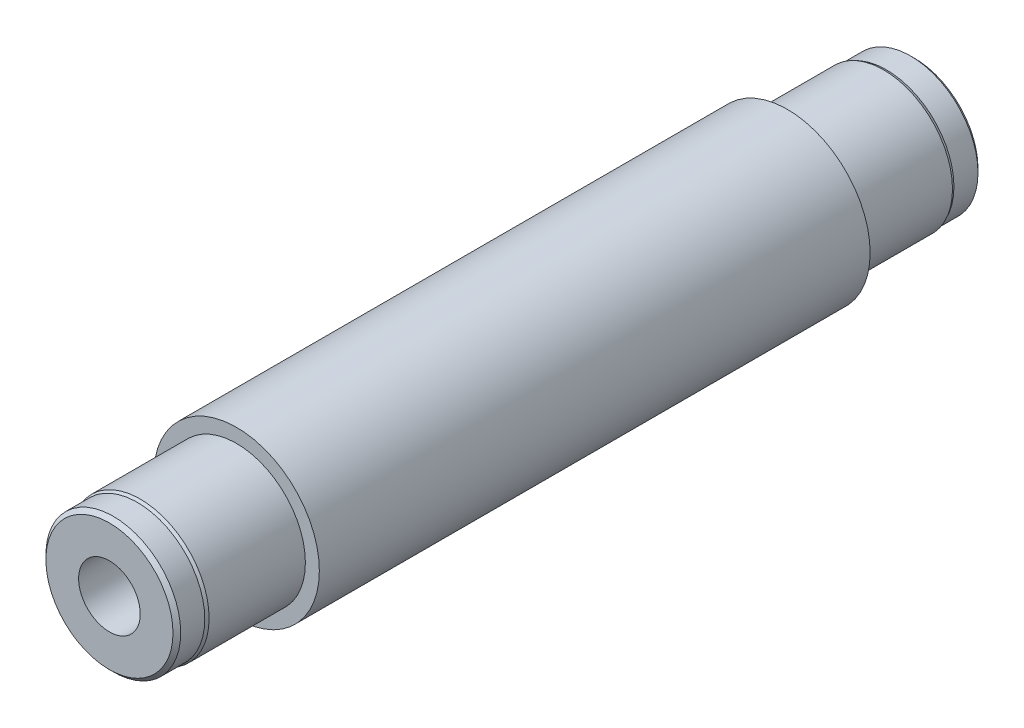
ISO-10303-21;
HEADER;
FILE_DESCRIPTION(('STEP AP214'),'2;1');
FILE_NAME('part.step','',(''),(''),'','','');
FILE_SCHEMA(('AUTOMOTIVE_DESIGN { 1 0 10303 214 1 1 1 1 }'));
ENDSEC;
DATA;
#1=APPLICATION_CONTEXT('core data for automotive mechanical design processes');
#2=APPLICATION_PROTOCOL_DEFINITION('international standard','automotive_design',2000,#1);
#3=PRODUCT_CONTEXT('',#1,'mechanical');
#4=PRODUCT('Part','Part','',(#3));
#5=PRODUCT_RELATED_PRODUCT_CATEGORY('part','',(#4));
#6=PRODUCT_DEFINITION_FORMATION('','',#4);
#7=PRODUCT_DEFINITION_CONTEXT('part definition',#1,'design');
#8=PRODUCT_DEFINITION('design','',#6,#7);
#9=PRODUCT_DEFINITION_SHAPE('','',#8);
#10=(LENGTH_UNIT() NAMED_UNIT(*) SI_UNIT(.MILLI.,.METRE.));
#11=(NAMED_UNIT(*) PLANE_ANGLE_UNIT() SI_UNIT($,.RADIAN.));
#12=(NAMED_UNIT(*) SI_UNIT($,.STERADIAN.) SOLID_ANGLE_UNIT());
#13=UNCERTAINTY_MEASURE_WITH_UNIT(LENGTH_MEASURE(1.E-05),#10,'distance_accuracy_value','');
#14=(GEOMETRIC_REPRESENTATION_CONTEXT(3) GLOBAL_UNCERTAINTY_ASSIGNED_CONTEXT((#13)) GLOBAL_UNIT_ASSIGNED_CONTEXT((#10,
#11,#12)) REPRESENTATION_CONTEXT('',''));
#15=CARTESIAN_POINT('',(0.,0.,0.));
#16=DIRECTION('',(0.,0.,1.));
#17=DIRECTION('',(1.,0.,0.));
#18=AXIS2_PLACEMENT_3D('',#15,#16,#17);
#19=CARTESIAN_POINT('',(0.,0.,19.3));
#20=DIRECTION('',(0.,0.,-1.));
#21=DIRECTION('',(1.,0.,0.));
#22=AXIS2_PLACEMENT_3D('',#19,#20,#21);
#23=CONICAL_SURFACE('',#22,3.575,0.463647609001);
#24=CARTESIAN_POINT('',(0.,0.,19.45));
#25=DIRECTION('',(0.,0.,1.));
#26=DIRECTION('',(1.,0.,0.));
#27=AXIS2_PLACEMENT_3D('',#24,#25,#26);
#28=CIRCLE('',#27,3.5);
#29=CARTESIAN_POINT('',(3.5,0.,19.45));
#30=VERTEX_POINT('',#29);
#31=EDGE_CURVE('E106',#30,#30,#28,.T.);
#32=ORIENTED_EDGE('',*,*,#31,.F.);
#33=DIRECTION('',(-0.447213595499958,0.,0.894427190999916));
#34=VECTOR('',#33,1.);
#35=CARTESIAN_POINT('',(3.575,0.,19.3));
#36=LINE('',#35,#34);
#37=CARTESIAN_POINT('',(3.575,0.,19.3));
#38=VERTEX_POINT('',#37);
#39=EDGE_CURVE('E9',#38,#30,#36,.T.);
#40=ORIENTED_EDGE('',*,*,#39,.F.);
#41=CARTESIAN_POINT('',(0.,0.,19.3));
#42=DIRECTION('',(0.,0.,1.));
#43=DIRECTION('',(1.,0.,0.));
#44=AXIS2_PLACEMENT_3D('',#41,#42,#43);
#45=CIRCLE('',#44,3.575);
#46=EDGE_CURVE('E110',#38,#38,#45,.T.);
#47=ORIENTED_EDGE('',*,*,#46,.T.);
#48=ORIENTED_EDGE('',*,*,#39,.T.);
#49=EDGE_LOOP('',(#32,#40,#47,#48));
#50=FACE_BOUND('',#49,.T.);
#51=ADVANCED_FACE('F14',(#50),#23,.T.);
#52=CARTESIAN_POINT('',(0.,0.,-20.9));
#53=DIRECTION('',(0.,0.,1.));
#54=DIRECTION('',(1.,0.,0.));
#55=AXIS2_PLACEMENT_3D('',#52,#53,#54);
#56=CYLINDRICAL_SURFACE('',#55,3.5);
#57=ORIENTED_EDGE('',*,*,#31,.T.);
#58=DIRECTION('',(0.,0.,1.));
#59=VECTOR('',#58,1.);
#60=CARTESIAN_POINT('',(3.5,0.,-20.9));
#61=LINE('',#60,#59);
#62=CARTESIAN_POINT('',(3.5,0.,20.7));
#63=VERTEX_POINT('',#62);
#64=EDGE_CURVE('E18',#30,#63,#61,.T.);
#65=ORIENTED_EDGE('',*,*,#64,.T.);
#66=CARTESIAN_POINT('',(0.,0.,20.7));
#67=DIRECTION('',(0.,0.,1.));
#68=DIRECTION('',(1.,0.,0.));
#69=AXIS2_PLACEMENT_3D('',#66,#67,#68);
#70=CIRCLE('',#69,3.5);
#71=EDGE_CURVE('E115',#63,#63,#70,.T.);
#72=ORIENTED_EDGE('',*,*,#71,.F.);
#73=ORIENTED_EDGE('',*,*,#64,.F.);
#74=EDGE_LOOP('',(#57,#65,#72,#73));
#75=FACE_BOUND('',#74,.T.);
#76=ADVANCED_FACE('F211',(#75),#56,.T.);
#77=CARTESIAN_POINT('',(0.,0.,-19.3));
#78=DIRECTION('',(0.,0.,1.));
#79=DIRECTION('',(1.,0.,0.));
#80=AXIS2_PLACEMENT_3D('',#77,#78,#79);
#81=CYLINDRICAL_SURFACE('',#80,3.575);
#82=DIRECTION('',(0.,0.,1.));
#83=VECTOR('',#82,1.);
#84=CARTESIAN_POINT('',(3.575,0.,-19.3));
#85=LINE('',#84,#83);
#86=CARTESIAN_POINT('',(3.575,0.,14.3));
#87=VERTEX_POINT('',#86);
#88=EDGE_CURVE('E111',#87,#38,#85,.T.);
#89=ORIENTED_EDGE('',*,*,#88,.T.);
#90=ORIENTED_EDGE('',*,*,#46,.F.);
#91=ORIENTED_EDGE('',*,*,#88,.F.);
#92=CARTESIAN_POINT('',(0.,0.,14.3));
#93=DIRECTION('',(0.,0.,1.));
#94=DIRECTION('',(1.,0.,0.));
#95=AXIS2_PLACEMENT_3D('',#92,#93,#94);
#96=CIRCLE('',#95,3.575);
#97=EDGE_CURVE('E105',#87,#87,#96,.T.);
#98=ORIENTED_EDGE('',*,*,#97,.T.);
#99=EDGE_LOOP('',(#89,#90,#91,#98));
#100=FACE_BOUND('',#99,.T.);
#101=ADVANCED_FACE('F216',(#100),#81,.T.);
#102=CARTESIAN_POINT('',(0.,0.,20.7));
#103=DIRECTION('',(0.,0.,-1.));
#104=DIRECTION('',(1.,0.,0.));
#105=AXIS2_PLACEMENT_3D('',#102,#103,#104);
#106=CONICAL_SURFACE('',#105,3.5,0.785398163397);
#107=DIRECTION('',(-0.707106781186548,0.,0.707106781186548));
#108=VECTOR('',#107,1.);
#109=CARTESIAN_POINT('',(3.5,0.,20.7));
#110=LINE('',#109,#108);
#111=CARTESIAN_POINT('',(3.3,0.,20.9));
#112=VERTEX_POINT('',#111);
#113=EDGE_CURVE('E127',#63,#112,#110,.T.);
#114=ORIENTED_EDGE('',*,*,#113,.F.);
#115=ORIENTED_EDGE('',*,*,#71,.T.);
#116=ORIENTED_EDGE('',*,*,#113,.T.);
#117=CARTESIAN_POINT('',(0.,0.,20.9));
#118=DIRECTION('',(0.,0.,1.));
#119=DIRECTION('',(1.,0.,0.));
#120=AXIS2_PLACEMENT_3D('',#117,#118,#119);
#121=CIRCLE('',#120,3.3);
#122=EDGE_CURVE('E90',#112,#112,#121,.T.);
#123=ORIENTED_EDGE('',*,*,#122,.F.);
#124=EDGE_LOOP('',(#114,#115,#116,#123));
#125=FACE_BOUND('',#124,.T.);
#126=ADVANCED_FACE('F16',(#125),#106,.T.);
#127=CARTESIAN_POINT('',(0.,0.,14.3));
#128=DIRECTION('',(0.,0.,1.));
#129=DIRECTION('',(1.,0.,0.));
#130=AXIS2_PLACEMENT_3D('',#127,#128,#129);
#131=PLANE('',#130);
#132=ORIENTED_EDGE('',*,*,#97,.F.);
#133=EDGE_LOOP('',(#132));
#134=FACE_BOUND('',#133,.T.);
#135=CARTESIAN_POINT('',(0.,0.,14.3));
#136=DIRECTION('',(0.,0.,1.));
#137=DIRECTION('',(1.,0.,0.));
#138=AXIS2_PLACEMENT_3D('',#135,#136,#137);
#139=CIRCLE('',#138,4.3);
#140=CARTESIAN_POINT('',(4.3,0.,14.3));
#141=VERTEX_POINT('',#140);
#142=EDGE_CURVE('E86',#141,#141,#139,.T.);
#143=ORIENTED_EDGE('',*,*,#142,.T.);
#144=EDGE_LOOP('',(#143));
#145=FACE_BOUND('',#144,.T.);
#146=ADVANCED_FACE('F93',(#134,#145),#131,.T.);
#147=CARTESIAN_POINT('',(0.,0.,20.9));
#148=DIRECTION('',(0.,0.,1.));
#149=DIRECTION('',(1.,0.,0.));
#150=AXIS2_PLACEMENT_3D('',#147,#148,#149);
#151=PLANE('',#150);
#152=CARTESIAN_POINT('',(0.,0.,20.9));
#153=DIRECTION('',(0.,0.,1.));
#154=DIRECTION('',(1.,0.,0.));
#155=AXIS2_PLACEMENT_3D('',#152,#153,#154);
#156=CIRCLE('',#155,1.6);
#157=CARTESIAN_POINT('',(1.6,0.,20.9));
#158=VERTEX_POINT('',#157);
#159=EDGE_CURVE('E95',#158,#158,#156,.T.);
#160=ORIENTED_EDGE('',*,*,#159,.F.);
#161=EDGE_LOOP('',(#160));
#162=FACE_BOUND('',#161,.T.);
#163=ORIENTED_EDGE('',*,*,#122,.T.);
#164=EDGE_LOOP('',(#163));
#165=FACE_BOUND('',#164,.T.);
#166=ADVANCED_FACE('F276',(#162,#165),#151,.T.);
#167=CARTESIAN_POINT('',(0.,0.,-14.3));
#168=DIRECTION('',(0.,0.,1.));
#169=DIRECTION('',(1.,0.,0.));
#170=AXIS2_PLACEMENT_3D('',#167,#168,#169);
#171=CYLINDRICAL_SURFACE('',#170,4.3);
#172=ORIENTED_EDGE('',*,*,#142,.F.);
#173=DIRECTION('',(0.,0.,1.));
#174=VECTOR('',#173,1.);
#175=CARTESIAN_POINT('',(4.3,0.,-14.3));
#176=LINE('',#175,#174);
#177=CARTESIAN_POINT('',(4.3,0.,-14.3));
#178=VERTEX_POINT('',#177);
#179=EDGE_CURVE('E83',#178,#141,#176,.T.);
#180=ORIENTED_EDGE('',*,*,#179,.F.);
#181=CARTESIAN_POINT('',(0.,0.,-14.3));
#182=DIRECTION('',(0.,0.,1.));
#183=DIRECTION('',(1.,0.,0.));
#184=AXIS2_PLACEMENT_3D('',#181,#182,#183);
#185=CIRCLE('',#184,4.3);
#186=EDGE_CURVE('E88',#178,#178,#185,.T.);
#187=ORIENTED_EDGE('',*,*,#186,.T.);
#188=ORIENTED_EDGE('',*,*,#179,.T.);
#189=EDGE_LOOP('',(#172,#180,#187,#188));
#190=FACE_BOUND('',#189,.T.);
#191=ADVANCED_FACE('F85',(#190),#171,.T.);
#192=CARTESIAN_POINT('',(0.,0.,-21.9));
#193=DIRECTION('',(0.,0.,1.));
#194=DIRECTION('',(1.,0.,0.));
#195=AXIS2_PLACEMENT_3D('',#192,#193,#194);
#196=CYLINDRICAL_SURFACE('',#195,1.6);
#197=DIRECTION('',(0.,0.,1.));
#198=VECTOR('',#197,1.);
#199=CARTESIAN_POINT('',(1.6,0.,-21.9));
#200=LINE('',#199,#198);
#201=CARTESIAN_POINT('',(1.6,0.,-20.9));
#202=VERTEX_POINT('',#201);
#203=EDGE_CURVE('E100',#202,#158,#200,.T.);
#204=ORIENTED_EDGE('',*,*,#203,.F.);
#205=CARTESIAN_POINT('',(0.,0.,-20.9));
#206=DIRECTION('',(0.,0.,1.));
#207=DIRECTION('',(1.,0.,0.));
#208=AXIS2_PLACEMENT_3D('',#205,#206,#207);
#209=CIRCLE('',#208,1.6);
#210=EDGE_CURVE('E122',#202,#202,#209,.T.);
#211=ORIENTED_EDGE('',*,*,#210,.F.);
#212=ORIENTED_EDGE('',*,*,#203,.T.);
#213=ORIENTED_EDGE('',*,*,#159,.T.);
#214=EDGE_LOOP('',(#204,#211,#212,#213));
#215=FACE_BOUND('',#214,.T.);
#216=ADVANCED_FACE('F172',(#215),#196,.F.);
#217=CARTESIAN_POINT('',(0.,0.,-14.3));
#218=DIRECTION('',(0.,0.,1.));
#219=DIRECTION('',(1.,0.,0.));
#220=AXIS2_PLACEMENT_3D('',#217,#218,#219);
#221=PLANE('',#220);
#222=CARTESIAN_POINT('',(0.,0.,-14.3));
#223=DIRECTION('',(0.,0.,1.));
#224=DIRECTION('',(1.,0.,0.));
#225=AXIS2_PLACEMENT_3D('',#222,#223,#224);
#226=CIRCLE('',#225,3.575);
#227=CARTESIAN_POINT('',(3.575,0.,-14.3));
#228=VERTEX_POINT('',#227);
#229=EDGE_CURVE('E139',#228,#228,#226,.T.);
#230=ORIENTED_EDGE('',*,*,#229,.T.);
#231=EDGE_LOOP('',(#230));
#232=FACE_BOUND('',#231,.T.);
#233=ORIENTED_EDGE('',*,*,#186,.F.);
#234=EDGE_LOOP('',(#233));
#235=FACE_BOUND('',#234,.T.);
#236=ADVANCED_FACE('F179',(#232,#235),#221,.F.);
#237=CARTESIAN_POINT('',(0.,0.,-20.9));
#238=DIRECTION('',(0.,0.,1.));
#239=DIRECTION('',(1.,0.,0.));
#240=AXIS2_PLACEMENT_3D('',#237,#238,#239);
#241=PLANE('',#240);
#242=ORIENTED_EDGE('',*,*,#210,.T.);
#243=EDGE_LOOP('',(#242));
#244=FACE_BOUND('',#243,.T.);
#245=CARTESIAN_POINT('',(0.,0.,-20.9));
#246=DIRECTION('',(0.,0.,1.));
#247=DIRECTION('',(1.,0.,0.));
#248=AXIS2_PLACEMENT_3D('',#245,#246,#247);
#249=CIRCLE('',#248,3.3);
#250=CARTESIAN_POINT('',(3.3,0.,-20.9));
#251=VERTEX_POINT('',#250);
#252=EDGE_CURVE('E116',#251,#251,#249,.T.);
#253=ORIENTED_EDGE('',*,*,#252,.F.);
#254=EDGE_LOOP('',(#253));
#255=FACE_BOUND('',#254,.T.);
#256=ADVANCED_FACE('F175',(#244,#255),#241,.F.);
#257=CARTESIAN_POINT('',(0.,0.,-19.3));
#258=DIRECTION('',(0.,0.,1.));
#259=DIRECTION('',(1.,0.,0.));
#260=AXIS2_PLACEMENT_3D('',#257,#258,#259);
#261=CYLINDRICAL_SURFACE('',#260,3.575);
#262=ORIENTED_EDGE('',*,*,#229,.F.);
#263=DIRECTION('',(0.,0.,1.));
#264=VECTOR('',#263,1.);
#265=CARTESIAN_POINT('',(3.575,0.,-19.3));
#266=LINE('',#265,#264);
#267=CARTESIAN_POINT('',(3.575,0.,-19.3));
#268=VERTEX_POINT('',#267);
#269=EDGE_CURVE('E125',#268,#228,#266,.T.);
#270=ORIENTED_EDGE('',*,*,#269,.F.);
#271=CARTESIAN_POINT('',(0.,0.,-19.3));
#272=DIRECTION('',(0.,0.,1.));
#273=DIRECTION('',(1.,0.,0.));
#274=AXIS2_PLACEMENT_3D('',#271,#272,#273);
#275=CIRCLE('',#274,3.575);
#276=EDGE_CURVE('E121',#268,#268,#275,.T.);
#277=ORIENTED_EDGE('',*,*,#276,.T.);
#278=ORIENTED_EDGE('',*,*,#269,.T.);
#279=EDGE_LOOP('',(#262,#270,#277,#278));
#280=FACE_BOUND('',#279,.T.);
#281=ADVANCED_FACE('F178',(#280),#261,.T.);
#282=CARTESIAN_POINT('',(0.,0.,-20.7));
#283=DIRECTION('',(0.,0.,1.));
#284=DIRECTION('',(1.,0.,0.));
#285=AXIS2_PLACEMENT_3D('',#282,#283,#284);
#286=CONICAL_SURFACE('',#285,3.5,0.785398163397);
#287=ORIENTED_EDGE('',*,*,#252,.T.);
#288=DIRECTION('',(-0.707106781186548,0.,-0.707106781186548));
#289=VECTOR('',#288,1.);
#290=CARTESIAN_POINT('',(3.5,0.,-20.7));
#291=LINE('',#290,#289);
#292=CARTESIAN_POINT('',(3.5,0.,-20.7));
#293=VERTEX_POINT('',#292);
#294=EDGE_CURVE('E120',#293,#251,#291,.T.);
#295=ORIENTED_EDGE('',*,*,#294,.F.);
#296=CARTESIAN_POINT('',(0.,0.,-20.7));
#297=DIRECTION('',(0.,0.,1.));
#298=DIRECTION('',(1.,0.,0.));
#299=AXIS2_PLACEMENT_3D('',#296,#297,#298);
#300=CIRCLE('',#299,3.5);
#301=EDGE_CURVE('E137',#293,#293,#300,.T.);
#302=ORIENTED_EDGE('',*,*,#301,.F.);
#303=ORIENTED_EDGE('',*,*,#294,.T.);
#304=EDGE_LOOP('',(#287,#295,#302,#303));
#305=FACE_BOUND('',#304,.T.);
#306=ADVANCED_FACE('F184',(#305),#286,.T.);
#307=CARTESIAN_POINT('',(0.,0.,-19.3));
#308=DIRECTION('',(0.,0.,1.));
#309=DIRECTION('',(1.,0.,0.));
#310=AXIS2_PLACEMENT_3D('',#307,#308,#309);
#311=CONICAL_SURFACE('',#310,3.575,0.463647609001);
#312=DIRECTION('',(-0.447213595499958,0.,-0.894427190999916));
#313=VECTOR('',#312,1.);
#314=CARTESIAN_POINT('',(3.575,0.,-19.3));
#315=LINE('',#314,#313);
#316=CARTESIAN_POINT('',(3.5,0.,-19.45));
#317=VERTEX_POINT('',#316);
#318=EDGE_CURVE('E148',#268,#317,#315,.T.);
#319=ORIENTED_EDGE('',*,*,#318,.F.);
#320=ORIENTED_EDGE('',*,*,#276,.F.);
#321=ORIENTED_EDGE('',*,*,#318,.T.);
#322=CARTESIAN_POINT('',(0.,0.,-19.45));
#323=DIRECTION('',(0.,0.,1.));
#324=DIRECTION('',(1.,0.,0.));
#325=AXIS2_PLACEMENT_3D('',#322,#323,#324);
#326=CIRCLE('',#325,3.5);
#327=EDGE_CURVE('E144',#317,#317,#326,.T.);
#328=ORIENTED_EDGE('',*,*,#327,.T.);
#329=EDGE_LOOP('',(#319,#320,#321,#328));
#330=FACE_BOUND('',#329,.T.);
#331=ADVANCED_FACE('F196',(#330),#311,.T.);
#332=CARTESIAN_POINT('',(0.,0.,-20.9));
#333=DIRECTION('',(0.,0.,1.));
#334=DIRECTION('',(1.,0.,0.));
#335=AXIS2_PLACEMENT_3D('',#332,#333,#334);
#336=CYLINDRICAL_SURFACE('',#335,3.5);
#337=DIRECTION('',(0.,0.,1.));
#338=VECTOR('',#337,1.);
#339=CARTESIAN_POINT('',(3.5,0.,-20.9));
#340=LINE('',#339,#338);
#341=EDGE_CURVE('E133',#293,#317,#340,.T.);
#342=ORIENTED_EDGE('',*,*,#341,.F.);
#343=ORIENTED_EDGE('',*,*,#301,.T.);
#344=ORIENTED_EDGE('',*,*,#341,.T.);
#345=ORIENTED_EDGE('',*,*,#327,.F.);
#346=EDGE_LOOP('',(#342,#343,#344,#345));
#347=FACE_BOUND('',#346,.T.);
#348=ADVANCED_FACE('F191',(#347),#336,.T.);
#349=CLOSED_SHELL('',(#51,#76,#101,#126,#146,#166,#191,#216,#236,#256,#281,#306,#331,#348));
#350=MANIFOLD_SOLID_BREP('B1',#349);
#351=ADVANCED_BREP_SHAPE_REPRESENTATION('',(#18,#350),#14);
#352=SHAPE_DEFINITION_REPRESENTATION(#9,#351);
ENDSEC;
END-ISO-10303-21;
